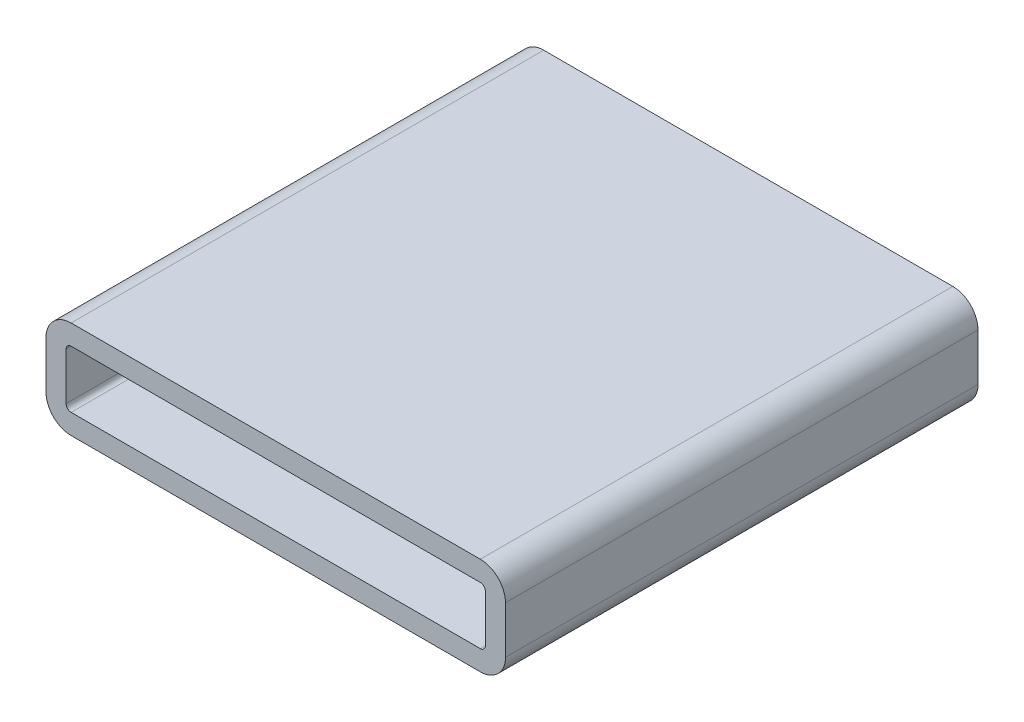
ISO-10303-21;
HEADER;
FILE_DESCRIPTION(('STEP AP214'),'2;1');
FILE_NAME('part.step','',(''),(''),'','','');
FILE_SCHEMA(('AUTOMOTIVE_DESIGN { 1 0 10303 214 1 1 1 1 }'));
ENDSEC;
DATA;
#1=APPLICATION_CONTEXT('core data for automotive mechanical design processes');
#2=APPLICATION_PROTOCOL_DEFINITION('international standard','automotive_design',2000,#1);
#3=PRODUCT_CONTEXT('',#1,'mechanical');
#4=PRODUCT('Part','Part','',(#3));
#5=PRODUCT_RELATED_PRODUCT_CATEGORY('part','',(#4));
#6=PRODUCT_DEFINITION_FORMATION('','',#4);
#7=PRODUCT_DEFINITION_CONTEXT('part definition',#1,'design');
#8=PRODUCT_DEFINITION('design','',#6,#7);
#9=PRODUCT_DEFINITION_SHAPE('','',#8);
#10=(LENGTH_UNIT() NAMED_UNIT(*) SI_UNIT(.MILLI.,.METRE.));
#11=(NAMED_UNIT(*) PLANE_ANGLE_UNIT() SI_UNIT($,.RADIAN.));
#12=(NAMED_UNIT(*) SI_UNIT($,.STERADIAN.) SOLID_ANGLE_UNIT());
#13=UNCERTAINTY_MEASURE_WITH_UNIT(LENGTH_MEASURE(1.E-05),#10,'distance_accuracy_value','');
#14=(GEOMETRIC_REPRESENTATION_CONTEXT(3) GLOBAL_UNCERTAINTY_ASSIGNED_CONTEXT((#13)) GLOBAL_UNIT_ASSIGNED_CONTEXT((#10,
#11,#12)) REPRESENTATION_CONTEXT('',''));
#15=CARTESIAN_POINT('',(0.,0.,0.));
#16=DIRECTION('',(0.,0.,1.));
#17=DIRECTION('',(1.,0.,0.));
#18=AXIS2_PLACEMENT_3D('',#15,#16,#17);
#19=CARTESIAN_POINT('',(-20.35,2.35,47.));
#20=DIRECTION('',(0.,0.,-1.));
#21=DIRECTION('',(-1.,0.,0.));
#22=AXIS2_PLACEMENT_3D('',#19,#20,#21);
#23=PLANE('',#22);
#24=CARTESIAN_POINT('',(-20.35,2.35,47.));
#25=DIRECTION('',(0.,0.,1.));
#26=DIRECTION('',(-1.,0.,0.));
#27=AXIS2_PLACEMENT_3D('',#24,#25,#26);
#28=CIRCLE('',#27,2.5);
#29=CARTESIAN_POINT('',(-20.35,4.85,47.));
#30=VERTEX_POINT('',#29);
#31=CARTESIAN_POINT('',(-22.85,2.35,47.));
#32=VERTEX_POINT('',#31);
#33=EDGE_CURVE('E211',#30,#32,#28,.T.);
#34=ORIENTED_EDGE('',*,*,#33,.T.);
#35=DIRECTION('',(0.,-1.,0.));
#36=VECTOR('',#35,1.);
#37=CARTESIAN_POINT('',(-22.85,-2.34999999999998,47.));
#38=LINE('',#37,#36);
#39=CARTESIAN_POINT('',(-22.85,-2.34999999999998,47.));
#40=VERTEX_POINT('',#39);
#41=EDGE_CURVE('E214',#32,#40,#38,.T.);
#42=ORIENTED_EDGE('',*,*,#41,.T.);
#43=CARTESIAN_POINT('',(-20.35,-2.35,47.));
#44=DIRECTION('',(0.,0.,1.));
#45=DIRECTION('',(-1.,0.,0.));
#46=AXIS2_PLACEMENT_3D('',#43,#44,#45);
#47=CIRCLE('',#46,2.5);
#48=CARTESIAN_POINT('',(-20.35,-4.85,47.));
#49=VERTEX_POINT('',#48);
#50=EDGE_CURVE('E217',#40,#49,#47,.T.);
#51=ORIENTED_EDGE('',*,*,#50,.T.);
#52=DIRECTION('',(1.,0.,0.));
#53=VECTOR('',#52,1.);
#54=CARTESIAN_POINT('',(-20.35,-4.85,47.));
#55=LINE('',#54,#53);
#56=CARTESIAN_POINT('',(20.35,-4.85,47.));
#57=VERTEX_POINT('',#56);
#58=EDGE_CURVE('E219',#49,#57,#55,.T.);
#59=ORIENTED_EDGE('',*,*,#58,.T.);
#60=CARTESIAN_POINT('',(20.35,-2.35,47.));
#61=DIRECTION('',(0.,0.,1.));
#62=DIRECTION('',(1.,0.,0.));
#63=AXIS2_PLACEMENT_3D('',#60,#61,#62);
#64=CIRCLE('',#63,2.5);
#65=CARTESIAN_POINT('',(22.85,-2.35,47.));
#66=VERTEX_POINT('',#65);
#67=EDGE_CURVE('E221',#57,#66,#64,.T.);
#68=ORIENTED_EDGE('',*,*,#67,.T.);
#69=DIRECTION('',(0.,1.,0.));
#70=VECTOR('',#69,1.);
#71=CARTESIAN_POINT('',(22.85,-2.35,47.));
#72=LINE('',#71,#70);
#73=CARTESIAN_POINT('',(22.85,2.34999999999998,47.));
#74=VERTEX_POINT('',#73);
#75=EDGE_CURVE('E223',#66,#74,#72,.T.);
#76=ORIENTED_EDGE('',*,*,#75,.T.);
#77=CARTESIAN_POINT('',(20.35,2.35,47.));
#78=DIRECTION('',(0.,0.,1.));
#79=DIRECTION('',(-1.,0.,0.));
#80=AXIS2_PLACEMENT_3D('',#77,#78,#79);
#81=CIRCLE('',#80,2.5);
#82=CARTESIAN_POINT('',(20.35,4.85,47.));
#83=VERTEX_POINT('',#82);
#84=EDGE_CURVE('E225',#74,#83,#81,.T.);
#85=ORIENTED_EDGE('',*,*,#84,.T.);
#86=DIRECTION('',(-1.,0.,0.));
#87=VECTOR('',#86,1.);
#88=CARTESIAN_POINT('',(-20.35,4.85,47.));
#89=LINE('',#88,#87);
#90=EDGE_CURVE('E227',#83,#30,#89,.T.);
#91=ORIENTED_EDGE('',*,*,#90,.T.);
#92=EDGE_LOOP('',(#34,#42,#51,#59,#68,#76,#85,#91));
#93=FACE_BOUND('',#92,.T.);
#94=CARTESIAN_POINT('',(-20.35,-2.35,47.));
#95=DIRECTION('',(0.,0.,1.));
#96=DIRECTION('',(-1.,0.,0.));
#97=AXIS2_PLACEMENT_3D('',#94,#95,#96);
#98=CIRCLE('',#97,0.5);
#99=CARTESIAN_POINT('',(-20.85,-2.35,47.));
#100=VERTEX_POINT('',#99);
#101=CARTESIAN_POINT('',(-20.35,-2.85,47.));
#102=VERTEX_POINT('',#101);
#103=EDGE_CURVE('E146',#100,#102,#98,.T.);
#104=ORIENTED_EDGE('',*,*,#103,.F.);
#105=DIRECTION('',(0.,-1.,0.));
#106=VECTOR('',#105,1.);
#107=CARTESIAN_POINT('',(-20.85,-2.35,47.));
#108=LINE('',#107,#106);
#109=CARTESIAN_POINT('',(-20.85,2.35,47.));
#110=VERTEX_POINT('',#109);
#111=EDGE_CURVE('E179',#110,#100,#108,.T.);
#112=ORIENTED_EDGE('',*,*,#111,.F.);
#113=CARTESIAN_POINT('',(-20.35,2.35,47.));
#114=DIRECTION('',(0.,0.,1.));
#115=DIRECTION('',(-1.,0.,0.));
#116=AXIS2_PLACEMENT_3D('',#113,#114,#115);
#117=CIRCLE('',#116,0.5);
#118=CARTESIAN_POINT('',(-20.35,2.85,47.));
#119=VERTEX_POINT('',#118);
#120=EDGE_CURVE('E177',#119,#110,#117,.T.);
#121=ORIENTED_EDGE('',*,*,#120,.F.);
#122=DIRECTION('',(-1.,0.,0.));
#123=VECTOR('',#122,1.);
#124=CARTESIAN_POINT('',(-20.35,2.85,47.));
#125=LINE('',#124,#123);
#126=CARTESIAN_POINT('',(20.35,2.85,47.));
#127=VERTEX_POINT('',#126);
#128=EDGE_CURVE('E175',#127,#119,#125,.T.);
#129=ORIENTED_EDGE('',*,*,#128,.F.);
#130=CARTESIAN_POINT('',(20.35,2.35,47.));
#131=DIRECTION('',(0.,0.,1.));
#132=DIRECTION('',(-1.,0.,0.));
#133=AXIS2_PLACEMENT_3D('',#130,#131,#132);
#134=CIRCLE('',#133,0.5);
#135=CARTESIAN_POINT('',(20.85,2.35,47.));
#136=VERTEX_POINT('',#135);
#137=EDGE_CURVE('E173',#136,#127,#134,.T.);
#138=ORIENTED_EDGE('',*,*,#137,.F.);
#139=DIRECTION('',(0.,1.,0.));
#140=VECTOR('',#139,1.);
#141=CARTESIAN_POINT('',(20.85,-2.35,47.));
#142=LINE('',#141,#140);
#143=CARTESIAN_POINT('',(20.85,-2.35,47.));
#144=VERTEX_POINT('',#143);
#145=EDGE_CURVE('E169',#144,#136,#142,.T.);
#146=ORIENTED_EDGE('',*,*,#145,.F.);
#147=CARTESIAN_POINT('',(20.35,-2.35,47.));
#148=DIRECTION('',(0.,0.,1.));
#149=DIRECTION('',(1.,0.,0.));
#150=AXIS2_PLACEMENT_3D('',#147,#148,#149);
#151=CIRCLE('',#150,0.5);
#152=CARTESIAN_POINT('',(20.35,-2.85,47.));
#153=VERTEX_POINT('',#152);
#154=EDGE_CURVE('E167',#153,#144,#151,.T.);
#155=ORIENTED_EDGE('',*,*,#154,.F.);
#156=DIRECTION('',(1.,0.,0.));
#157=VECTOR('',#156,1.);
#158=CARTESIAN_POINT('',(-20.35,-2.85,47.));
#159=LINE('',#158,#157);
#160=EDGE_CURVE('E154',#102,#153,#159,.T.);
#161=ORIENTED_EDGE('',*,*,#160,.F.);
#162=EDGE_LOOP('',(#104,#112,#121,#129,#138,#146,#155,#161));
#163=FACE_BOUND('',#162,.T.);
#164=ADVANCED_FACE('F33',(#93,#163),#23,.F.);
#165=CARTESIAN_POINT('',(-20.35,2.35,0.));
#166=DIRECTION('',(0.,0.,-1.));
#167=DIRECTION('',(-1.,0.,0.));
#168=AXIS2_PLACEMENT_3D('',#165,#166,#167);
#169=PLANE('',#168);
#170=CARTESIAN_POINT('',(-20.35,2.35,0.));
#171=DIRECTION('',(0.,0.,1.));
#172=DIRECTION('',(-1.,0.,0.));
#173=AXIS2_PLACEMENT_3D('',#170,#171,#172);
#174=CIRCLE('',#173,2.5);
#175=CARTESIAN_POINT('',(-20.35,4.85,0.));
#176=VERTEX_POINT('',#175);
#177=CARTESIAN_POINT('',(-22.85,2.35,0.));
#178=VERTEX_POINT('',#177);
#179=EDGE_CURVE('E162',#176,#178,#174,.T.);
#180=ORIENTED_EDGE('',*,*,#179,.F.);
#181=DIRECTION('',(-1.,0.,0.));
#182=VECTOR('',#181,1.);
#183=CARTESIAN_POINT('',(-20.35,4.85,0.));
#184=LINE('',#183,#182);
#185=CARTESIAN_POINT('',(20.35,4.85,0.));
#186=VERTEX_POINT('',#185);
#187=EDGE_CURVE('E215',#186,#176,#184,.T.);
#188=ORIENTED_EDGE('',*,*,#187,.F.);
#189=CARTESIAN_POINT('',(20.35,2.35,0.));
#190=DIRECTION('',(0.,0.,1.));
#191=DIRECTION('',(-1.,0.,0.));
#192=AXIS2_PLACEMENT_3D('',#189,#190,#191);
#193=CIRCLE('',#192,2.5);
#194=CARTESIAN_POINT('',(22.85,2.34999999999998,0.));
#195=VERTEX_POINT('',#194);
#196=EDGE_CURVE('E242',#195,#186,#193,.T.);
#197=ORIENTED_EDGE('',*,*,#196,.F.);
#198=DIRECTION('',(0.,1.,0.));
#199=VECTOR('',#198,1.);
#200=CARTESIAN_POINT('',(22.85,-2.35,0.));
#201=LINE('',#200,#199);
#202=CARTESIAN_POINT('',(22.85,-2.35,0.));
#203=VERTEX_POINT('',#202);
#204=EDGE_CURVE('E240',#203,#195,#201,.T.);
#205=ORIENTED_EDGE('',*,*,#204,.F.);
#206=CARTESIAN_POINT('',(20.35,-2.35,0.));
#207=DIRECTION('',(0.,0.,1.));
#208=DIRECTION('',(1.,0.,0.));
#209=AXIS2_PLACEMENT_3D('',#206,#207,#208);
#210=CIRCLE('',#209,2.5);
#211=CARTESIAN_POINT('',(20.35,-4.85,0.));
#212=VERTEX_POINT('',#211);
#213=EDGE_CURVE('E238',#212,#203,#210,.T.);
#214=ORIENTED_EDGE('',*,*,#213,.F.);
#215=DIRECTION('',(1.,0.,0.));
#216=VECTOR('',#215,1.);
#217=CARTESIAN_POINT('',(-20.35,-4.85,0.));
#218=LINE('',#217,#216);
#219=CARTESIAN_POINT('',(-20.35,-4.85,0.));
#220=VERTEX_POINT('',#219);
#221=EDGE_CURVE('E236',#220,#212,#218,.T.);
#222=ORIENTED_EDGE('',*,*,#221,.F.);
#223=CARTESIAN_POINT('',(-20.35,-2.35,0.));
#224=DIRECTION('',(0.,0.,1.));
#225=DIRECTION('',(-1.,0.,0.));
#226=AXIS2_PLACEMENT_3D('',#223,#224,#225);
#227=CIRCLE('',#226,2.5);
#228=CARTESIAN_POINT('',(-22.85,-2.34999999999998,0.));
#229=VERTEX_POINT('',#228);
#230=EDGE_CURVE('E234',#229,#220,#227,.T.);
#231=ORIENTED_EDGE('',*,*,#230,.F.);
#232=DIRECTION('',(0.,-1.,0.));
#233=VECTOR('',#232,1.);
#234=CARTESIAN_POINT('',(-22.85,-2.34999999999998,0.));
#235=LINE('',#234,#233);
#236=EDGE_CURVE('E232',#178,#229,#235,.T.);
#237=ORIENTED_EDGE('',*,*,#236,.F.);
#238=EDGE_LOOP('',(#180,#188,#197,#205,#214,#222,#231,#237));
#239=FACE_BOUND('',#238,.T.);
#240=DIRECTION('',(0.,-1.,0.));
#241=VECTOR('',#240,1.);
#242=CARTESIAN_POINT('',(-20.85,-2.35,0.));
#243=LINE('',#242,#241);
#244=CARTESIAN_POINT('',(-20.85,2.35,0.));
#245=VERTEX_POINT('',#244);
#246=CARTESIAN_POINT('',(-20.85,-2.35,0.));
#247=VERTEX_POINT('',#246);
#248=EDGE_CURVE('E155',#245,#247,#243,.T.);
#249=ORIENTED_EDGE('',*,*,#248,.T.);
#250=CARTESIAN_POINT('',(-20.35,-2.35,0.));
#251=DIRECTION('',(0.,0.,1.));
#252=DIRECTION('',(-1.,0.,0.));
#253=AXIS2_PLACEMENT_3D('',#250,#251,#252);
#254=CIRCLE('',#253,0.5);
#255=CARTESIAN_POINT('',(-20.35,-2.85,0.));
#256=VERTEX_POINT('',#255);
#257=EDGE_CURVE('E56',#247,#256,#254,.T.);
#258=ORIENTED_EDGE('',*,*,#257,.T.);
#259=DIRECTION('',(1.,0.,0.));
#260=VECTOR('',#259,1.);
#261=CARTESIAN_POINT('',(-20.35,-2.85,0.));
#262=LINE('',#261,#260);
#263=CARTESIAN_POINT('',(20.35,-2.85,0.));
#264=VERTEX_POINT('',#263);
#265=EDGE_CURVE('E161',#256,#264,#262,.T.);
#266=ORIENTED_EDGE('',*,*,#265,.T.);
#267=CARTESIAN_POINT('',(20.35,-2.35,0.));
#268=DIRECTION('',(0.,0.,1.));
#269=DIRECTION('',(1.,0.,0.));
#270=AXIS2_PLACEMENT_3D('',#267,#268,#269);
#271=CIRCLE('',#270,0.5);
#272=CARTESIAN_POINT('',(20.85,-2.35,0.));
#273=VERTEX_POINT('',#272);
#274=EDGE_CURVE('E183',#264,#273,#271,.T.);
#275=ORIENTED_EDGE('',*,*,#274,.T.);
#276=DIRECTION('',(0.,1.,0.));
#277=VECTOR('',#276,1.);
#278=CARTESIAN_POINT('',(20.85,-2.35,0.));
#279=LINE('',#278,#277);
#280=CARTESIAN_POINT('',(20.85,2.35,0.));
#281=VERTEX_POINT('',#280);
#282=EDGE_CURVE('E186',#273,#281,#279,.T.);
#283=ORIENTED_EDGE('',*,*,#282,.T.);
#284=CARTESIAN_POINT('',(20.35,2.35,0.));
#285=DIRECTION('',(0.,0.,1.));
#286=DIRECTION('',(-1.,0.,0.));
#287=AXIS2_PLACEMENT_3D('',#284,#285,#286);
#288=CIRCLE('',#287,0.5);
#289=CARTESIAN_POINT('',(20.35,2.85,0.));
#290=VERTEX_POINT('',#289);
#291=EDGE_CURVE('E189',#281,#290,#288,.T.);
#292=ORIENTED_EDGE('',*,*,#291,.T.);
#293=DIRECTION('',(-1.,0.,0.));
#294=VECTOR('',#293,1.);
#295=CARTESIAN_POINT('',(-20.35,2.85,0.));
#296=LINE('',#295,#294);
#297=CARTESIAN_POINT('',(-20.35,2.85,0.));
#298=VERTEX_POINT('',#297);
#299=EDGE_CURVE('E192',#290,#298,#296,.T.);
#300=ORIENTED_EDGE('',*,*,#299,.T.);
#301=CARTESIAN_POINT('',(-20.35,2.35,0.));
#302=DIRECTION('',(0.,0.,1.));
#303=DIRECTION('',(-1.,0.,0.));
#304=AXIS2_PLACEMENT_3D('',#301,#302,#303);
#305=CIRCLE('',#304,0.5);
#306=EDGE_CURVE('E195',#298,#245,#305,.T.);
#307=ORIENTED_EDGE('',*,*,#306,.T.);
#308=EDGE_LOOP('',(#249,#258,#266,#275,#283,#292,#300,#307));
#309=FACE_BOUND('',#308,.T.);
#310=ADVANCED_FACE('F272',(#239,#309),#169,.T.);
#311=CARTESIAN_POINT('',(-20.35,2.35,47.));
#312=DIRECTION('',(0.,0.,-1.));
#313=DIRECTION('',(-1.,0.,0.));
#314=AXIS2_PLACEMENT_3D('',#311,#312,#313);
#315=CYLINDRICAL_SURFACE('',#314,2.5);
#316=ORIENTED_EDGE('',*,*,#179,.T.);
#317=DIRECTION('',(0.,0.,-1.));
#318=VECTOR('',#317,1.);
#319=CARTESIAN_POINT('',(-22.85,2.35,47.));
#320=LINE('',#319,#318);
#321=EDGE_CURVE('E11',#32,#178,#320,.T.);
#322=ORIENTED_EDGE('',*,*,#321,.F.);
#323=ORIENTED_EDGE('',*,*,#33,.F.);
#324=DIRECTION('',(0.,0.,-1.));
#325=VECTOR('',#324,1.);
#326=CARTESIAN_POINT('',(-20.35,4.85,47.));
#327=LINE('',#326,#325);
#328=EDGE_CURVE('E229',#30,#176,#327,.T.);
#329=ORIENTED_EDGE('',*,*,#328,.T.);
#330=EDGE_LOOP('',(#316,#322,#323,#329));
#331=FACE_BOUND('',#330,.T.);
#332=ADVANCED_FACE('F35',(#331),#315,.T.);
#333=CARTESIAN_POINT('',(-22.85,-2.34999999999998,47.));
#334=DIRECTION('',(1.,0.,0.));
#335=DIRECTION('',(0.,0.,-1.));
#336=AXIS2_PLACEMENT_3D('',#333,#334,#335);
#337=PLANE('',#336);
#338=ORIENTED_EDGE('',*,*,#236,.T.);
#339=DIRECTION('',(0.,0.,-1.));
#340=VECTOR('',#339,1.);
#341=CARTESIAN_POINT('',(-22.85,-2.34999999999998,47.));
#342=LINE('',#341,#340);
#343=EDGE_CURVE('E41',#40,#229,#342,.T.);
#344=ORIENTED_EDGE('',*,*,#343,.F.);
#345=ORIENTED_EDGE('',*,*,#41,.F.);
#346=ORIENTED_EDGE('',*,*,#321,.T.);
#347=EDGE_LOOP('',(#338,#344,#345,#346));
#348=FACE_BOUND('',#347,.T.);
#349=ADVANCED_FACE('F289',(#348),#337,.F.);
#350=CARTESIAN_POINT('',(-20.35,-2.35,47.));
#351=DIRECTION('',(0.,0.,-1.));
#352=DIRECTION('',(-1.,0.,0.));
#353=AXIS2_PLACEMENT_3D('',#350,#351,#352);
#354=CYLINDRICAL_SURFACE('',#353,2.5);
#355=ORIENTED_EDGE('',*,*,#230,.T.);
#356=DIRECTION('',(0.,0.,-1.));
#357=VECTOR('',#356,1.);
#358=CARTESIAN_POINT('',(-20.35,-4.85,47.));
#359=LINE('',#358,#357);
#360=EDGE_CURVE('E259',#49,#220,#359,.T.);
#361=ORIENTED_EDGE('',*,*,#360,.F.);
#362=ORIENTED_EDGE('',*,*,#50,.F.);
#363=ORIENTED_EDGE('',*,*,#343,.T.);
#364=EDGE_LOOP('',(#355,#361,#362,#363));
#365=FACE_BOUND('',#364,.T.);
#366=ADVANCED_FACE('F266',(#365),#354,.T.);
#367=CARTESIAN_POINT('',(-20.35,-4.85,47.));
#368=DIRECTION('',(0.,1.,0.));
#369=DIRECTION('',(0.,0.,1.));
#370=AXIS2_PLACEMENT_3D('',#367,#368,#369);
#371=PLANE('',#370);
#372=ORIENTED_EDGE('',*,*,#221,.T.);
#373=DIRECTION('',(0.,0.,-1.));
#374=VECTOR('',#373,1.);
#375=CARTESIAN_POINT('',(20.35,-4.85,47.));
#376=LINE('',#375,#374);
#377=EDGE_CURVE('E256',#57,#212,#376,.T.);
#378=ORIENTED_EDGE('',*,*,#377,.F.);
#379=ORIENTED_EDGE('',*,*,#58,.F.);
#380=ORIENTED_EDGE('',*,*,#360,.T.);
#381=EDGE_LOOP('',(#372,#378,#379,#380));
#382=FACE_BOUND('',#381,.T.);
#383=ADVANCED_FACE('F278',(#382),#371,.F.);
#384=CARTESIAN_POINT('',(20.35,-2.35,47.));
#385=DIRECTION('',(0.,0.,-1.));
#386=DIRECTION('',(-1.,0.,0.));
#387=AXIS2_PLACEMENT_3D('',#384,#385,#386);
#388=CYLINDRICAL_SURFACE('',#387,2.5);
#389=ORIENTED_EDGE('',*,*,#213,.T.);
#390=DIRECTION('',(0.,0.,-1.));
#391=VECTOR('',#390,1.);
#392=CARTESIAN_POINT('',(22.85,-2.35,47.));
#393=LINE('',#392,#391);
#394=EDGE_CURVE('E253',#66,#203,#393,.T.);
#395=ORIENTED_EDGE('',*,*,#394,.F.);
#396=ORIENTED_EDGE('',*,*,#67,.F.);
#397=ORIENTED_EDGE('',*,*,#377,.T.);
#398=EDGE_LOOP('',(#389,#395,#396,#397));
#399=FACE_BOUND('',#398,.T.);
#400=ADVANCED_FACE('F282',(#399),#388,.T.);
#401=CARTESIAN_POINT('',(22.85,-2.35,47.));
#402=DIRECTION('',(-1.,0.,0.));
#403=DIRECTION('',(0.,0.,1.));
#404=AXIS2_PLACEMENT_3D('',#401,#402,#403);
#405=PLANE('',#404);
#406=ORIENTED_EDGE('',*,*,#204,.T.);
#407=DIRECTION('',(0.,0.,-1.));
#408=VECTOR('',#407,1.);
#409=CARTESIAN_POINT('',(22.85,2.34999999999998,47.));
#410=LINE('',#409,#408);
#411=EDGE_CURVE('E250',#74,#195,#410,.T.);
#412=ORIENTED_EDGE('',*,*,#411,.F.);
#413=ORIENTED_EDGE('',*,*,#75,.F.);
#414=ORIENTED_EDGE('',*,*,#394,.T.);
#415=EDGE_LOOP('',(#406,#412,#413,#414));
#416=FACE_BOUND('',#415,.T.);
#417=ADVANCED_FACE('F302',(#416),#405,.F.);
#418=CARTESIAN_POINT('',(20.35,2.35,47.));
#419=DIRECTION('',(0.,0.,-1.));
#420=DIRECTION('',(-1.,0.,0.));
#421=AXIS2_PLACEMENT_3D('',#418,#419,#420);
#422=CYLINDRICAL_SURFACE('',#421,2.5);
#423=ORIENTED_EDGE('',*,*,#196,.T.);
#424=DIRECTION('',(0.,0.,-1.));
#425=VECTOR('',#424,1.);
#426=CARTESIAN_POINT('',(20.35,4.85,47.));
#427=LINE('',#426,#425);
#428=EDGE_CURVE('E247',#83,#186,#427,.T.);
#429=ORIENTED_EDGE('',*,*,#428,.F.);
#430=ORIENTED_EDGE('',*,*,#84,.F.);
#431=ORIENTED_EDGE('',*,*,#411,.T.);
#432=EDGE_LOOP('',(#423,#429,#430,#431));
#433=FACE_BOUND('',#432,.T.);
#434=ADVANCED_FACE('F300',(#433),#422,.T.);
#435=CARTESIAN_POINT('',(-20.35,4.85,47.));
#436=DIRECTION('',(0.,-1.,0.));
#437=DIRECTION('',(0.,0.,-1.));
#438=AXIS2_PLACEMENT_3D('',#435,#436,#437);
#439=PLANE('',#438);
#440=ORIENTED_EDGE('',*,*,#187,.T.);
#441=ORIENTED_EDGE('',*,*,#328,.F.);
#442=ORIENTED_EDGE('',*,*,#90,.F.);
#443=ORIENTED_EDGE('',*,*,#428,.T.);
#444=EDGE_LOOP('',(#440,#441,#442,#443));
#445=FACE_BOUND('',#444,.T.);
#446=ADVANCED_FACE('F295',(#445),#439,.F.);
#447=CARTESIAN_POINT('',(-20.35,-2.35,47.));
#448=DIRECTION('',(0.,0.,-1.));
#449=DIRECTION('',(-1.,0.,0.));
#450=AXIS2_PLACEMENT_3D('',#447,#448,#449);
#451=CYLINDRICAL_SURFACE('',#450,0.5);
#452=ORIENTED_EDGE('',*,*,#257,.F.);
#453=DIRECTION('',(0.,0.,-1.));
#454=VECTOR('',#453,1.);
#455=CARTESIAN_POINT('',(-20.85,-2.35,47.));
#456=LINE('',#455,#454);
#457=EDGE_CURVE('E150',#100,#247,#456,.T.);
#458=ORIENTED_EDGE('',*,*,#457,.F.);
#459=ORIENTED_EDGE('',*,*,#103,.T.);
#460=DIRECTION('',(0.,0.,-1.));
#461=VECTOR('',#460,1.);
#462=CARTESIAN_POINT('',(-20.35,-2.85,47.));
#463=LINE('',#462,#461);
#464=EDGE_CURVE('E149',#102,#256,#463,.T.);
#465=ORIENTED_EDGE('',*,*,#464,.T.);
#466=EDGE_LOOP('',(#452,#458,#459,#465));
#467=FACE_BOUND('',#466,.T.);
#468=ADVANCED_FACE('F148',(#467),#451,.F.);
#469=CARTESIAN_POINT('',(-20.35,-2.85,47.));
#470=DIRECTION('',(0.,1.,0.));
#471=DIRECTION('',(0.,0.,1.));
#472=AXIS2_PLACEMENT_3D('',#469,#470,#471);
#473=PLANE('',#472);
#474=ORIENTED_EDGE('',*,*,#265,.F.);
#475=ORIENTED_EDGE('',*,*,#464,.F.);
#476=ORIENTED_EDGE('',*,*,#160,.T.);
#477=DIRECTION('',(0.,0.,-1.));
#478=VECTOR('',#477,1.);
#479=CARTESIAN_POINT('',(20.35,-2.85,47.));
#480=LINE('',#479,#478);
#481=EDGE_CURVE('E163',#153,#264,#480,.T.);
#482=ORIENTED_EDGE('',*,*,#481,.T.);
#483=EDGE_LOOP('',(#474,#475,#476,#482));
#484=FACE_BOUND('',#483,.T.);
#485=ADVANCED_FACE('F158',(#484),#473,.T.);
#486=CARTESIAN_POINT('',(20.35,-2.35,47.));
#487=DIRECTION('',(0.,0.,-1.));
#488=DIRECTION('',(-1.,0.,0.));
#489=AXIS2_PLACEMENT_3D('',#486,#487,#488);
#490=CYLINDRICAL_SURFACE('',#489,0.5);
#491=ORIENTED_EDGE('',*,*,#274,.F.);
#492=ORIENTED_EDGE('',*,*,#481,.F.);
#493=ORIENTED_EDGE('',*,*,#154,.T.);
#494=DIRECTION('',(0.,0.,-1.));
#495=VECTOR('',#494,1.);
#496=CARTESIAN_POINT('',(20.85,-2.35,47.));
#497=LINE('',#496,#495);
#498=EDGE_CURVE('E208',#144,#273,#497,.T.);
#499=ORIENTED_EDGE('',*,*,#498,.T.);
#500=EDGE_LOOP('',(#491,#492,#493,#499));
#501=FACE_BOUND('',#500,.T.);
#502=ADVANCED_FACE('F327',(#501),#490,.F.);
#503=CARTESIAN_POINT('',(20.85,-2.35,47.));
#504=DIRECTION('',(-1.,0.,0.));
#505=DIRECTION('',(0.,0.,1.));
#506=AXIS2_PLACEMENT_3D('',#503,#504,#505);
#507=PLANE('',#506);
#508=ORIENTED_EDGE('',*,*,#282,.F.);
#509=ORIENTED_EDGE('',*,*,#498,.F.);
#510=ORIENTED_EDGE('',*,*,#145,.T.);
#511=DIRECTION('',(0.,0.,-1.));
#512=VECTOR('',#511,1.);
#513=CARTESIAN_POINT('',(20.85,2.35,47.));
#514=LINE('',#513,#512);
#515=EDGE_CURVE('E206',#136,#281,#514,.T.);
#516=ORIENTED_EDGE('',*,*,#515,.T.);
#517=EDGE_LOOP('',(#508,#509,#510,#516));
#518=FACE_BOUND('',#517,.T.);
#519=ADVANCED_FACE('F331',(#518),#507,.T.);
#520=CARTESIAN_POINT('',(20.35,2.35,47.));
#521=DIRECTION('',(0.,0.,-1.));
#522=DIRECTION('',(-1.,0.,0.));
#523=AXIS2_PLACEMENT_3D('',#520,#521,#522);
#524=CYLINDRICAL_SURFACE('',#523,0.5);
#525=ORIENTED_EDGE('',*,*,#291,.F.);
#526=ORIENTED_EDGE('',*,*,#515,.F.);
#527=ORIENTED_EDGE('',*,*,#137,.T.);
#528=DIRECTION('',(0.,0.,-1.));
#529=VECTOR('',#528,1.);
#530=CARTESIAN_POINT('',(20.35,2.85,47.));
#531=LINE('',#530,#529);
#532=EDGE_CURVE('E204',#127,#290,#531,.T.);
#533=ORIENTED_EDGE('',*,*,#532,.T.);
#534=EDGE_LOOP('',(#525,#526,#527,#533));
#535=FACE_BOUND('',#534,.T.);
#536=ADVANCED_FACE('F337',(#535),#524,.F.);
#537=CARTESIAN_POINT('',(-20.35,2.85,47.));
#538=DIRECTION('',(0.,-1.,0.));
#539=DIRECTION('',(0.,0.,-1.));
#540=AXIS2_PLACEMENT_3D('',#537,#538,#539);
#541=PLANE('',#540);
#542=ORIENTED_EDGE('',*,*,#299,.F.);
#543=ORIENTED_EDGE('',*,*,#532,.F.);
#544=ORIENTED_EDGE('',*,*,#128,.T.);
#545=DIRECTION('',(0.,0.,-1.));
#546=VECTOR('',#545,1.);
#547=CARTESIAN_POINT('',(-20.35,2.85,47.));
#548=LINE('',#547,#546);
#549=EDGE_CURVE('E202',#119,#298,#548,.T.);
#550=ORIENTED_EDGE('',*,*,#549,.T.);
#551=EDGE_LOOP('',(#542,#543,#544,#550));
#552=FACE_BOUND('',#551,.T.);
#553=ADVANCED_FACE('F341',(#552),#541,.T.);
#554=CARTESIAN_POINT('',(-20.35,2.35,47.));
#555=DIRECTION('',(0.,0.,-1.));
#556=DIRECTION('',(-1.,0.,0.));
#557=AXIS2_PLACEMENT_3D('',#554,#555,#556);
#558=CYLINDRICAL_SURFACE('',#557,0.5);
#559=ORIENTED_EDGE('',*,*,#306,.F.);
#560=ORIENTED_EDGE('',*,*,#549,.F.);
#561=ORIENTED_EDGE('',*,*,#120,.T.);
#562=DIRECTION('',(0.,0.,-1.));
#563=VECTOR('',#562,1.);
#564=CARTESIAN_POINT('',(-20.85,2.35,47.));
#565=LINE('',#564,#563);
#566=EDGE_CURVE('E48',#110,#245,#565,.T.);
#567=ORIENTED_EDGE('',*,*,#566,.T.);
#568=EDGE_LOOP('',(#559,#560,#561,#567));
#569=FACE_BOUND('',#568,.T.);
#570=ADVANCED_FACE('F345',(#569),#558,.F.);
#571=CARTESIAN_POINT('',(-20.85,-2.35,47.));
#572=DIRECTION('',(1.,0.,0.));
#573=DIRECTION('',(0.,0.,-1.));
#574=AXIS2_PLACEMENT_3D('',#571,#572,#573);
#575=PLANE('',#574);
#576=ORIENTED_EDGE('',*,*,#248,.F.);
#577=ORIENTED_EDGE('',*,*,#566,.F.);
#578=ORIENTED_EDGE('',*,*,#111,.T.);
#579=ORIENTED_EDGE('',*,*,#457,.T.);
#580=EDGE_LOOP('',(#576,#577,#578,#579));
#581=FACE_BOUND('',#580,.T.);
#582=ADVANCED_FACE('F349',(#581),#575,.T.);
#583=CLOSED_SHELL('',(#164,#310,#332,#349,#366,#383,#400,#417,#434,#446,#468,#485,#502,#519,
#536,#553,#570,#582));
#584=MANIFOLD_SOLID_BREP('B2',#583);
#585=ADVANCED_BREP_SHAPE_REPRESENTATION('',(#18,#584),#14);
#586=SHAPE_DEFINITION_REPRESENTATION(#9,#585);
ENDSEC;
END-ISO-10303-21;
